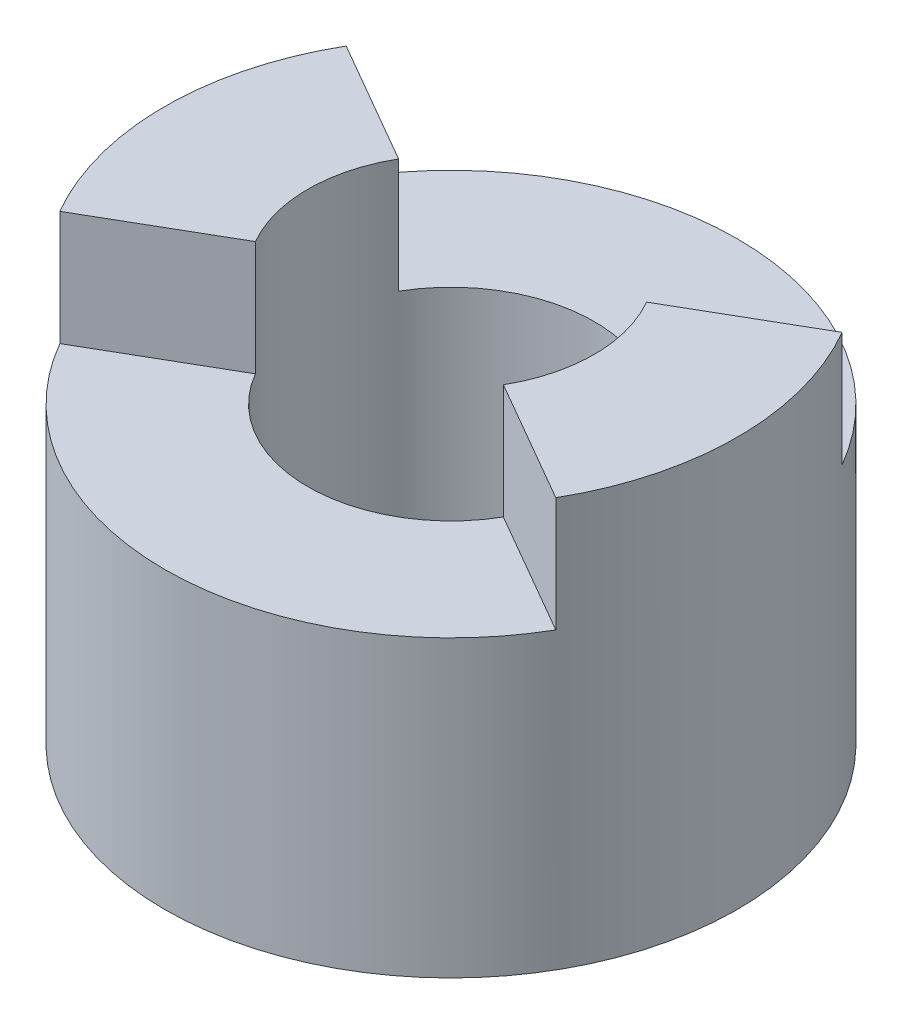
ISO-10303-21;
HEADER;
FILE_DESCRIPTION(('STEP AP214'),'2;1');
FILE_NAME('part.step','',(''),(''),'','','');
FILE_SCHEMA(('AUTOMOTIVE_DESIGN { 1 0 10303 214 1 1 1 1 }'));
ENDSEC;
DATA;
#1=APPLICATION_CONTEXT('core data for automotive mechanical design processes');
#2=APPLICATION_PROTOCOL_DEFINITION('international standard','automotive_design',2000,#1);
#3=PRODUCT_CONTEXT('',#1,'mechanical');
#4=PRODUCT('Part','Part','',(#3));
#5=PRODUCT_RELATED_PRODUCT_CATEGORY('part','',(#4));
#6=PRODUCT_DEFINITION_FORMATION('','',#4);
#7=PRODUCT_DEFINITION_CONTEXT('part definition',#1,'design');
#8=PRODUCT_DEFINITION('design','',#6,#7);
#9=PRODUCT_DEFINITION_SHAPE('','',#8);
#10=(LENGTH_UNIT() NAMED_UNIT(*) SI_UNIT(.MILLI.,.METRE.));
#11=(NAMED_UNIT(*) PLANE_ANGLE_UNIT() SI_UNIT($,.RADIAN.));
#12=(NAMED_UNIT(*) SI_UNIT($,.STERADIAN.) SOLID_ANGLE_UNIT());
#13=UNCERTAINTY_MEASURE_WITH_UNIT(LENGTH_MEASURE(1.E-05),#10,'distance_accuracy_value','');
#14=(GEOMETRIC_REPRESENTATION_CONTEXT(3) GLOBAL_UNCERTAINTY_ASSIGNED_CONTEXT((#13)) GLOBAL_UNIT_ASSIGNED_CONTEXT((#10,
#11,#12)) REPRESENTATION_CONTEXT('',''));
#15=CARTESIAN_POINT('',(0.,0.,0.));
#16=DIRECTION('',(0.,0.,1.));
#17=DIRECTION('',(1.,0.,0.));
#18=AXIS2_PLACEMENT_3D('',#15,#16,#17);
#19=CARTESIAN_POINT('',(0.,50.,0.));
#20=DIRECTION('',(0.,1.,0.));
#21=DIRECTION('',(0.,0.,1.));
#22=AXIS2_PLACEMENT_3D('',#19,#20,#21);
#23=PLANE('',#22);
#24=CARTESIAN_POINT('',(0.,50.,0.));
#25=DIRECTION('',(0.,1.,0.));
#26=DIRECTION('',(0.,0.,1.));
#27=AXIS2_PLACEMENT_3D('',#24,#25,#26);
#28=CIRCLE('',#27,17.5);
#29=CARTESIAN_POINT('',(-15.1554445662277,50.,-8.74999999999997));
#30=VERTEX_POINT('',#29);
#31=CARTESIAN_POINT('',(-15.1554445662277,50.,8.74999999999997));
#32=VERTEX_POINT('',#31);
#33=EDGE_CURVE('E117',#30,#32,#28,.T.);
#34=ORIENTED_EDGE('',*,*,#33,.F.);
#35=DIRECTION('',(-0.86602540378444,0.,-0.499999999999998));
#36=VECTOR('',#35,1.);
#37=CARTESIAN_POINT('',(-15.1554445662277,50.,-8.74999999999997));
#38=LINE('',#37,#36);
#39=CARTESIAN_POINT('',(-30.3108891324554,50.,-17.4999999999999));
#40=VERTEX_POINT('',#39);
#41=EDGE_CURVE('E105',#30,#40,#38,.T.);
#42=ORIENTED_EDGE('',*,*,#41,.T.);
#43=CARTESIAN_POINT('',(0.,50.,0.));
#44=DIRECTION('',(0.,1.,0.));
#45=DIRECTION('',(0.,0.,1.));
#46=AXIS2_PLACEMENT_3D('',#43,#44,#45);
#47=CIRCLE('',#46,35.);
#48=CARTESIAN_POINT('',(-30.3108891324554,50.,17.4999999999999));
#49=VERTEX_POINT('',#48);
#50=EDGE_CURVE('E44',#40,#49,#47,.T.);
#51=ORIENTED_EDGE('',*,*,#50,.T.);
#52=DIRECTION('',(-0.86602540378444,0.,0.499999999999998));
#53=VECTOR('',#52,1.);
#54=CARTESIAN_POINT('',(-15.1554445662277,50.,8.74999999999997));
#55=LINE('',#54,#53);
#56=EDGE_CURVE('E136',#32,#49,#55,.T.);
#57=ORIENTED_EDGE('',*,*,#56,.F.);
#58=EDGE_LOOP('',(#34,#42,#51,#57));
#59=FACE_BOUND('',#58,.T.);
#60=ADVANCED_FACE('F35',(#59),#23,.T.);
#61=CARTESIAN_POINT('',(30.3108891324554,50.,17.4999999999999));
#62=VERTEX_POINT('',#61);
#63=CARTESIAN_POINT('',(30.3108891324554,50.,-17.4999999999999));
#64=VERTEX_POINT('',#63);
#65=EDGE_CURVE('E12',#62,#64,#47,.T.);
#66=ORIENTED_EDGE('',*,*,#65,.T.);
#67=DIRECTION('',(-0.86602540378444,0.,0.499999999999998));
#68=VECTOR('',#67,1.);
#69=CARTESIAN_POINT('',(15.1554445662277,50.,-8.74999999999997));
#70=LINE('',#69,#68);
#71=CARTESIAN_POINT('',(15.1554445662277,50.,-8.74999999999997));
#72=VERTEX_POINT('',#71);
#73=EDGE_CURVE('E111',#64,#72,#70,.T.);
#74=ORIENTED_EDGE('',*,*,#73,.T.);
#75=CARTESIAN_POINT('',(15.1554445662277,50.,8.74999999999997));
#76=VERTEX_POINT('',#75);
#77=EDGE_CURVE('E124',#76,#72,#28,.T.);
#78=ORIENTED_EDGE('',*,*,#77,.F.);
#79=DIRECTION('',(-0.86602540378444,0.,-0.499999999999998));
#80=VECTOR('',#79,1.);
#81=CARTESIAN_POINT('',(15.1554445662277,50.,8.74999999999997));
#82=LINE('',#81,#80);
#83=EDGE_CURVE('E145',#62,#76,#82,.T.);
#84=ORIENTED_EDGE('',*,*,#83,.F.);
#85=EDGE_LOOP('',(#66,#74,#78,#84));
#86=FACE_BOUND('',#85,.T.);
#87=ADVANCED_FACE('F176',(#86),#23,.T.);
#88=CARTESIAN_POINT('',(0.,50.,0.));
#89=DIRECTION('',(0.,-1.,0.));
#90=DIRECTION('',(0.,0.,-1.));
#91=AXIS2_PLACEMENT_3D('',#88,#89,#90);
#92=CYLINDRICAL_SURFACE('',#91,35.);
#93=CARTESIAN_POINT('',(0.,0.,0.));
#94=DIRECTION('',(0.,1.,0.));
#95=DIRECTION('',(0.,0.,1.));
#96=AXIS2_PLACEMENT_3D('',#93,#94,#95);
#97=CIRCLE('',#96,35.);
#98=CARTESIAN_POINT('',(0.,0.,35.));
#99=VERTEX_POINT('',#98);
#100=EDGE_CURVE('E39',#99,#99,#97,.T.);
#101=ORIENTED_EDGE('',*,*,#100,.T.);
#102=EDGE_LOOP('',(#101));
#103=FACE_BOUND('',#102,.T.);
#104=DIRECTION('',(0.,1.,0.));
#105=VECTOR('',#104,1.);
#106=CARTESIAN_POINT('',(-30.3108891324554,-66.0610513086192,-17.4999999999999));
#107=LINE('',#106,#105);
#108=CARTESIAN_POINT('',(-30.3108891324554,36.,-17.4999999999999));
#109=VERTEX_POINT('',#108);
#110=EDGE_CURVE('E102',#109,#40,#107,.T.);
#111=ORIENTED_EDGE('',*,*,#110,.F.);
#112=CARTESIAN_POINT('',(0.,36.,0.));
#113=DIRECTION('',(0.,1.,0.));
#114=DIRECTION('',(0.,0.,1.));
#115=AXIS2_PLACEMENT_3D('',#112,#113,#114);
#116=CIRCLE('',#115,35.);
#117=CARTESIAN_POINT('',(30.3108891324554,36.,-17.4999999999999));
#118=VERTEX_POINT('',#117);
#119=EDGE_CURVE('E147',#118,#109,#116,.T.);
#120=ORIENTED_EDGE('',*,*,#119,.F.);
#121=DIRECTION('',(0.,1.,0.));
#122=VECTOR('',#121,1.);
#123=CARTESIAN_POINT('',(30.3108891324554,-66.0610513086192,-17.4999999999999));
#124=LINE('',#123,#122);
#125=EDGE_CURVE('E154',#118,#64,#124,.T.);
#126=ORIENTED_EDGE('',*,*,#125,.T.);
#127=ORIENTED_EDGE('',*,*,#65,.F.);
#128=DIRECTION('',(0.,1.,0.));
#129=VECTOR('',#128,1.);
#130=CARTESIAN_POINT('',(30.3108891324554,-66.0610513086192,17.4999999999999));
#131=LINE('',#130,#129);
#132=CARTESIAN_POINT('',(30.3108891324554,36.,17.4999999999999));
#133=VERTEX_POINT('',#132);
#134=EDGE_CURVE('E133',#133,#62,#131,.T.);
#135=ORIENTED_EDGE('',*,*,#134,.F.);
#136=CARTESIAN_POINT('',(0.,36.,0.));
#137=DIRECTION('',(0.,1.,0.));
#138=DIRECTION('',(0.,0.,1.));
#139=AXIS2_PLACEMENT_3D('',#136,#137,#138);
#140=CIRCLE('',#139,35.);
#141=CARTESIAN_POINT('',(-30.3108891324554,36.,17.4999999999999));
#142=VERTEX_POINT('',#141);
#143=EDGE_CURVE('E132',#133,#142,#140,.F.);
#144=ORIENTED_EDGE('',*,*,#143,.T.);
#145=DIRECTION('',(0.,1.,0.));
#146=VECTOR('',#145,1.);
#147=CARTESIAN_POINT('',(-30.3108891324554,-66.0610513086192,17.4999999999999));
#148=LINE('',#147,#146);
#149=EDGE_CURVE('E122',#142,#49,#148,.T.);
#150=ORIENTED_EDGE('',*,*,#149,.T.);
#151=ORIENTED_EDGE('',*,*,#50,.F.);
#152=EDGE_LOOP('',(#111,#120,#126,#127,#135,#144,#150,#151));
#153=FACE_BOUND('',#152,.T.);
#154=ADVANCED_FACE('F37',(#103,#153),#92,.T.);
#155=CARTESIAN_POINT('',(0.,50.,0.));
#156=DIRECTION('',(0.,-1.,0.));
#157=DIRECTION('',(0.,0.,-1.));
#158=AXIS2_PLACEMENT_3D('',#155,#156,#157);
#159=CYLINDRICAL_SURFACE('',#158,17.5);
#160=CARTESIAN_POINT('',(0.,0.,0.));
#161=DIRECTION('',(0.,1.,0.));
#162=DIRECTION('',(0.,0.,1.));
#163=AXIS2_PLACEMENT_3D('',#160,#161,#162);
#164=CIRCLE('',#163,17.5);
#165=CARTESIAN_POINT('',(0.,0.,17.5));
#166=VERTEX_POINT('',#165);
#167=EDGE_CURVE('E126',#166,#166,#164,.T.);
#168=ORIENTED_EDGE('',*,*,#167,.F.);
#169=EDGE_LOOP('',(#168));
#170=FACE_BOUND('',#169,.T.);
#171=CARTESIAN_POINT('',(0.,36.,0.));
#172=DIRECTION('',(0.,1.,0.));
#173=DIRECTION('',(0.,0.,1.));
#174=AXIS2_PLACEMENT_3D('',#171,#172,#173);
#175=CIRCLE('',#174,17.5);
#176=CARTESIAN_POINT('',(-15.1554445662277,36.,-8.74999999999997));
#177=VERTEX_POINT('',#176);
#178=CARTESIAN_POINT('',(15.1554445662277,36.,-8.74999999999997));
#179=VERTEX_POINT('',#178);
#180=EDGE_CURVE('E153',#177,#179,#175,.F.);
#181=ORIENTED_EDGE('',*,*,#180,.F.);
#182=DIRECTION('',(0.,1.,0.));
#183=VECTOR('',#182,1.);
#184=CARTESIAN_POINT('',(-15.1554445662277,-66.0610513086192,-8.74999999999997));
#185=LINE('',#184,#183);
#186=EDGE_CURVE('E110',#177,#30,#185,.T.);
#187=ORIENTED_EDGE('',*,*,#186,.T.);
#188=ORIENTED_EDGE('',*,*,#33,.T.);
#189=DIRECTION('',(0.,1.,0.));
#190=VECTOR('',#189,1.);
#191=CARTESIAN_POINT('',(-15.1554445662277,-66.0610513086192,8.74999999999997));
#192=LINE('',#191,#190);
#193=CARTESIAN_POINT('',(-15.1554445662277,36.,8.74999999999997));
#194=VERTEX_POINT('',#193);
#195=EDGE_CURVE('E139',#194,#32,#192,.T.);
#196=ORIENTED_EDGE('',*,*,#195,.F.);
#197=CARTESIAN_POINT('',(0.,36.,0.));
#198=DIRECTION('',(0.,1.,0.));
#199=DIRECTION('',(0.,0.,1.));
#200=AXIS2_PLACEMENT_3D('',#197,#198,#199);
#201=CIRCLE('',#200,17.5);
#202=CARTESIAN_POINT('',(15.1554445662277,36.,8.74999999999997));
#203=VERTEX_POINT('',#202);
#204=EDGE_CURVE('E143',#194,#203,#201,.T.);
#205=ORIENTED_EDGE('',*,*,#204,.T.);
#206=DIRECTION('',(0.,1.,0.));
#207=VECTOR('',#206,1.);
#208=CARTESIAN_POINT('',(15.1554445662277,-66.0610513086192,8.74999999999997));
#209=LINE('',#208,#207);
#210=EDGE_CURVE('E135',#203,#76,#209,.T.);
#211=ORIENTED_EDGE('',*,*,#210,.T.);
#212=ORIENTED_EDGE('',*,*,#77,.T.);
#213=DIRECTION('',(0.,1.,0.));
#214=VECTOR('',#213,1.);
#215=CARTESIAN_POINT('',(15.1554445662277,-66.0610513086192,-8.74999999999997));
#216=LINE('',#215,#214);
#217=EDGE_CURVE('E157',#179,#72,#216,.T.);
#218=ORIENTED_EDGE('',*,*,#217,.F.);
#219=EDGE_LOOP('',(#181,#187,#188,#196,#205,#211,#212,#218));
#220=FACE_BOUND('',#219,.T.);
#221=ADVANCED_FACE('F171',(#170,#220),#159,.F.);
#222=CARTESIAN_POINT('',(0.,0.,0.));
#223=DIRECTION('',(0.,1.,0.));
#224=DIRECTION('',(0.,0.,1.));
#225=AXIS2_PLACEMENT_3D('',#222,#223,#224);
#226=PLANE('',#225);
#227=ORIENTED_EDGE('',*,*,#100,.F.);
#228=EDGE_LOOP('',(#227));
#229=FACE_BOUND('',#228,.T.);
#230=ORIENTED_EDGE('',*,*,#167,.T.);
#231=EDGE_LOOP('',(#230));
#232=FACE_BOUND('',#231,.T.);
#233=ADVANCED_FACE('F187',(#229,#232),#226,.F.);
#234=CARTESIAN_POINT('',(-15.1554445662277,-66.0610513086192,8.74999999999997));
#235=DIRECTION('',(-0.499999999999998,0.,-0.86602540378444));
#236=DIRECTION('',(-0.86602540378444,0.,0.499999999999998));
#237=AXIS2_PLACEMENT_3D('',#234,#235,#236);
#238=PLANE('',#237);
#239=DIRECTION('',(0.86602540378444,0.,-0.499999999999998));
#240=VECTOR('',#239,1.);
#241=CARTESIAN_POINT('',(-15.1554445662277,36.,8.74999999999997));
#242=LINE('',#241,#240);
#243=EDGE_CURVE('E149',#142,#194,#242,.T.);
#244=ORIENTED_EDGE('',*,*,#243,.T.);
#245=ORIENTED_EDGE('',*,*,#195,.T.);
#246=ORIENTED_EDGE('',*,*,#56,.T.);
#247=ORIENTED_EDGE('',*,*,#149,.F.);
#248=EDGE_LOOP('',(#244,#245,#246,#247));
#249=FACE_BOUND('',#248,.T.);
#250=ADVANCED_FACE('F185',(#249),#238,.F.);
#251=CARTESIAN_POINT('',(15.1554445662277,-66.0610513086192,8.74999999999997));
#252=DIRECTION('',(0.499999999999997,0.,-0.86602540378444));
#253=DIRECTION('',(-0.86602540378444,0.,-0.499999999999998));
#254=AXIS2_PLACEMENT_3D('',#251,#252,#253);
#255=PLANE('',#254);
#256=DIRECTION('',(0.86602540378444,0.,0.499999999999998));
#257=VECTOR('',#256,1.);
#258=CARTESIAN_POINT('',(15.1554445662277,36.,8.74999999999997));
#259=LINE('',#258,#257);
#260=EDGE_CURVE('E59',#203,#133,#259,.T.);
#261=ORIENTED_EDGE('',*,*,#260,.T.);
#262=ORIENTED_EDGE('',*,*,#134,.T.);
#263=ORIENTED_EDGE('',*,*,#83,.T.);
#264=ORIENTED_EDGE('',*,*,#210,.F.);
#265=EDGE_LOOP('',(#261,#262,#263,#264));
#266=FACE_BOUND('',#265,.T.);
#267=ADVANCED_FACE('F181',(#266),#255,.F.);
#268=CARTESIAN_POINT('',(0.,36.,0.));
#269=DIRECTION('',(0.,1.,0.));
#270=DIRECTION('',(0.,0.,1.));
#271=AXIS2_PLACEMENT_3D('',#268,#269,#270);
#272=PLANE('',#271);
#273=ORIENTED_EDGE('',*,*,#143,.F.);
#274=ORIENTED_EDGE('',*,*,#260,.F.);
#275=ORIENTED_EDGE('',*,*,#204,.F.);
#276=ORIENTED_EDGE('',*,*,#243,.F.);
#277=EDGE_LOOP('',(#273,#274,#275,#276));
#278=FACE_BOUND('',#277,.T.);
#279=ADVANCED_FACE('F182',(#278),#272,.T.);
#280=CARTESIAN_POINT('',(-15.1554445662277,-66.0610513086192,-8.74999999999997));
#281=DIRECTION('',(0.499999999999998,0.,-0.86602540378444));
#282=DIRECTION('',(-0.86602540378444,0.,-0.499999999999998));
#283=AXIS2_PLACEMENT_3D('',#280,#281,#282);
#284=PLANE('',#283);
#285=ORIENTED_EDGE('',*,*,#110,.T.);
#286=ORIENTED_EDGE('',*,*,#41,.F.);
#287=ORIENTED_EDGE('',*,*,#186,.F.);
#288=DIRECTION('',(0.86602540378444,0.,0.499999999999998));
#289=VECTOR('',#288,1.);
#290=CARTESIAN_POINT('',(-15.1554445662277,36.,-8.74999999999997));
#291=LINE('',#290,#289);
#292=EDGE_CURVE('E51',#109,#177,#291,.T.);
#293=ORIENTED_EDGE('',*,*,#292,.F.);
#294=EDGE_LOOP('',(#285,#286,#287,#293));
#295=FACE_BOUND('',#294,.T.);
#296=ADVANCED_FACE('F104',(#295),#284,.T.);
#297=CARTESIAN_POINT('',(15.1554445662277,-66.0610513086192,-8.74999999999997));
#298=DIRECTION('',(-0.499999999999997,0.,-0.86602540378444));
#299=DIRECTION('',(-0.86602540378444,0.,0.499999999999998));
#300=AXIS2_PLACEMENT_3D('',#297,#298,#299);
#301=PLANE('',#300);
#302=ORIENTED_EDGE('',*,*,#217,.T.);
#303=ORIENTED_EDGE('',*,*,#73,.F.);
#304=ORIENTED_EDGE('',*,*,#125,.F.);
#305=DIRECTION('',(0.86602540378444,0.,-0.499999999999998));
#306=VECTOR('',#305,1.);
#307=CARTESIAN_POINT('',(15.1554445662277,36.,-8.74999999999997));
#308=LINE('',#307,#306);
#309=EDGE_CURVE('E164',#179,#118,#308,.T.);
#310=ORIENTED_EDGE('',*,*,#309,.F.);
#311=EDGE_LOOP('',(#302,#303,#304,#310));
#312=FACE_BOUND('',#311,.T.);
#313=ADVANCED_FACE('F174',(#312),#301,.T.);
#314=CARTESIAN_POINT('',(0.,36.,0.));
#315=DIRECTION('',(0.,1.,0.));
#316=DIRECTION('',(0.,0.,1.));
#317=AXIS2_PLACEMENT_3D('',#314,#315,#316);
#318=PLANE('',#317);
#319=ORIENTED_EDGE('',*,*,#309,.T.);
#320=ORIENTED_EDGE('',*,*,#119,.T.);
#321=ORIENTED_EDGE('',*,*,#292,.T.);
#322=ORIENTED_EDGE('',*,*,#180,.T.);
#323=EDGE_LOOP('',(#319,#320,#321,#322));
#324=FACE_BOUND('',#323,.T.);
#325=ADVANCED_FACE('F169',(#324),#318,.T.);
#326=CLOSED_SHELL('',(#60,#87,#154,#221,#233,#250,#267,#279,#296,#313,#325));
#327=MANIFOLD_SOLID_BREP('B2',#326);
#328=ADVANCED_BREP_SHAPE_REPRESENTATION('',(#18,#327),#14);
#329=SHAPE_DEFINITION_REPRESENTATION(#9,#328);
ENDSEC;
END-ISO-10303-21;
